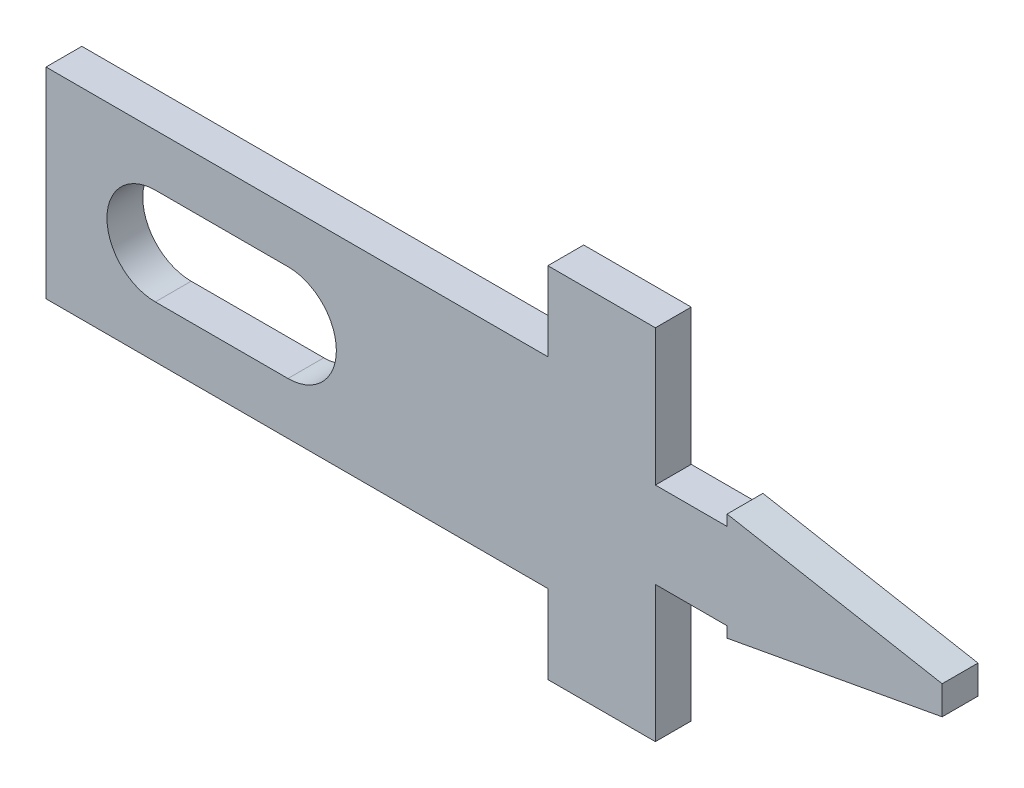
ISO-10303-21;
HEADER;
FILE_DESCRIPTION(('STEP AP214'),'2;1');
FILE_NAME('part.step','',(''),(''),'','','');
FILE_SCHEMA(('AUTOMOTIVE_DESIGN { 1 0 10303 214 1 1 1 1 }'));
ENDSEC;
DATA;
#1=APPLICATION_CONTEXT('core data for automotive mechanical design processes');
#2=APPLICATION_PROTOCOL_DEFINITION('international standard','automotive_design',2000,#1);
#3=PRODUCT_CONTEXT('',#1,'mechanical');
#4=PRODUCT('Part','Part','',(#3));
#5=PRODUCT_RELATED_PRODUCT_CATEGORY('part','',(#4));
#6=PRODUCT_DEFINITION_FORMATION('','',#4);
#7=PRODUCT_DEFINITION_CONTEXT('part definition',#1,'design');
#8=PRODUCT_DEFINITION('design','',#6,#7);
#9=PRODUCT_DEFINITION_SHAPE('','',#8);
#10=(LENGTH_UNIT() NAMED_UNIT(*) SI_UNIT(.MILLI.,.METRE.));
#11=(NAMED_UNIT(*) PLANE_ANGLE_UNIT() SI_UNIT($,.RADIAN.));
#12=(NAMED_UNIT(*) SI_UNIT($,.STERADIAN.) SOLID_ANGLE_UNIT());
#13=UNCERTAINTY_MEASURE_WITH_UNIT(LENGTH_MEASURE(1.E-05),#10,'distance_accuracy_value','');
#14=(GEOMETRIC_REPRESENTATION_CONTEXT(3) GLOBAL_UNCERTAINTY_ASSIGNED_CONTEXT((#13)) GLOBAL_UNIT_ASSIGNED_CONTEXT((#10,
#11,#12)) REPRESENTATION_CONTEXT('',''));
#15=CARTESIAN_POINT('',(0.,0.,0.));
#16=DIRECTION('',(0.,0.,1.));
#17=DIRECTION('',(1.,0.,0.));
#18=AXIS2_PLACEMENT_3D('',#15,#16,#17);
#19=CARTESIAN_POINT('',(0.,0.,0.5));
#20=DIRECTION('',(0.,0.,1.));
#21=DIRECTION('',(1.,0.,0.));
#22=AXIS2_PLACEMENT_3D('',#19,#20,#21);
#23=PLANE('',#22);
#24=DIRECTION('',(0.,1.,0.));
#25=VECTOR('',#24,1.);
#26=CARTESIAN_POINT('',(6.25,0.200000000000002,0.5));
#27=LINE('',#26,#25);
#28=CARTESIAN_POINT('',(6.25,-0.200000000000003,0.5));
#29=VERTEX_POINT('',#28);
#30=CARTESIAN_POINT('',(6.25,0.200000000000002,0.5));
#31=VERTEX_POINT('',#30);
#32=EDGE_CURVE('E225',#29,#31,#27,.T.);
#33=ORIENTED_EDGE('',*,*,#32,.T.);
#34=DIRECTION('',(-0.983606557377049,0.180327868852458,0.));
#35=VECTOR('',#34,1.);
#36=CARTESIAN_POINT('',(3.25,0.75,0.5));
#37=LINE('',#36,#35);
#38=CARTESIAN_POINT('',(3.25,0.75,0.5));
#39=VERTEX_POINT('',#38);
#40=EDGE_CURVE('E229',#31,#39,#37,.T.);
#41=ORIENTED_EDGE('',*,*,#40,.T.);
#42=DIRECTION('',(0.,-1.,0.));
#43=VECTOR('',#42,1.);
#44=CARTESIAN_POINT('',(3.25,0.6,0.5));
#45=LINE('',#44,#43);
#46=CARTESIAN_POINT('',(3.25,0.6,0.5));
#47=VERTEX_POINT('',#46);
#48=EDGE_CURVE('E233',#39,#47,#45,.T.);
#49=ORIENTED_EDGE('',*,*,#48,.T.);
#50=DIRECTION('',(-1.,0.,0.));
#51=VECTOR('',#50,1.);
#52=CARTESIAN_POINT('',(2.25,0.6,0.5));
#53=LINE('',#52,#51);
#54=CARTESIAN_POINT('',(2.25,0.6,0.5));
#55=VERTEX_POINT('',#54);
#56=EDGE_CURVE('E236',#47,#55,#53,.T.);
#57=ORIENTED_EDGE('',*,*,#56,.T.);
#58=DIRECTION('',(0.,1.,0.));
#59=VECTOR('',#58,1.);
#60=CARTESIAN_POINT('',(2.25,2.5,0.5));
#61=LINE('',#60,#59);
#62=CARTESIAN_POINT('',(2.25,2.5,0.5));
#63=VERTEX_POINT('',#62);
#64=EDGE_CURVE('E239',#55,#63,#61,.T.);
#65=ORIENTED_EDGE('',*,*,#64,.T.);
#66=DIRECTION('',(-1.,0.,0.));
#67=VECTOR('',#66,1.);
#68=CARTESIAN_POINT('',(0.749999999999999,2.5,0.5));
#69=LINE('',#68,#67);
#70=CARTESIAN_POINT('',(0.749999999999999,2.5,0.5));
#71=VERTEX_POINT('',#70);
#72=EDGE_CURVE('E242',#63,#71,#69,.T.);
#73=ORIENTED_EDGE('',*,*,#72,.T.);
#74=DIRECTION('',(0.,-1.,0.));
#75=VECTOR('',#74,1.);
#76=CARTESIAN_POINT('',(0.749999999999999,1.4,0.5));
#77=LINE('',#76,#75);
#78=CARTESIAN_POINT('',(0.749999999999999,1.4,0.5));
#79=VERTEX_POINT('',#78);
#80=EDGE_CURVE('E245',#71,#79,#77,.T.);
#81=ORIENTED_EDGE('',*,*,#80,.T.);
#82=DIRECTION('',(-1.,0.,0.));
#83=VECTOR('',#82,1.);
#84=CARTESIAN_POINT('',(-6.25,1.4,0.5));
#85=LINE('',#84,#83);
#86=CARTESIAN_POINT('',(-6.25,1.4,0.5));
#87=VERTEX_POINT('',#86);
#88=EDGE_CURVE('E248',#79,#87,#85,.T.);
#89=ORIENTED_EDGE('',*,*,#88,.T.);
#90=DIRECTION('',(0.,-1.,0.));
#91=VECTOR('',#90,1.);
#92=CARTESIAN_POINT('',(-6.25,-1.4,0.5));
#93=LINE('',#92,#91);
#94=CARTESIAN_POINT('',(-6.25,-1.4,0.5));
#95=VERTEX_POINT('',#94);
#96=EDGE_CURVE('E251',#87,#95,#93,.T.);
#97=ORIENTED_EDGE('',*,*,#96,.T.);
#98=DIRECTION('',(1.,0.,0.));
#99=VECTOR('',#98,1.);
#100=CARTESIAN_POINT('',(-6.25,-1.4,0.5));
#101=LINE('',#100,#99);
#102=CARTESIAN_POINT('',(0.749999999999999,-1.4,0.5));
#103=VERTEX_POINT('',#102);
#104=EDGE_CURVE('E254',#95,#103,#101,.T.);
#105=ORIENTED_EDGE('',*,*,#104,.T.);
#106=DIRECTION('',(0.,-1.,0.));
#107=VECTOR('',#106,1.);
#108=CARTESIAN_POINT('',(0.749999999999999,-1.4,0.5));
#109=LINE('',#108,#107);
#110=CARTESIAN_POINT('',(0.749999999999999,-2.5,0.5));
#111=VERTEX_POINT('',#110);
#112=EDGE_CURVE('E257',#103,#111,#109,.T.);
#113=ORIENTED_EDGE('',*,*,#112,.T.);
#114=DIRECTION('',(1.,0.,0.));
#115=VECTOR('',#114,1.);
#116=CARTESIAN_POINT('',(0.749999999999999,-2.5,0.5));
#117=LINE('',#116,#115);
#118=CARTESIAN_POINT('',(2.25,-2.5,0.5));
#119=VERTEX_POINT('',#118);
#120=EDGE_CURVE('E260',#111,#119,#117,.T.);
#121=ORIENTED_EDGE('',*,*,#120,.T.);
#122=DIRECTION('',(0.,1.,0.));
#123=VECTOR('',#122,1.);
#124=CARTESIAN_POINT('',(2.25,-2.5,0.5));
#125=LINE('',#124,#123);
#126=CARTESIAN_POINT('',(2.25,-0.600000000000001,0.5));
#127=VERTEX_POINT('',#126);
#128=EDGE_CURVE('E263',#119,#127,#125,.T.);
#129=ORIENTED_EDGE('',*,*,#128,.T.);
#130=DIRECTION('',(1.,0.,0.));
#131=VECTOR('',#130,1.);
#132=CARTESIAN_POINT('',(2.25,-0.600000000000001,0.5));
#133=LINE('',#132,#131);
#134=CARTESIAN_POINT('',(3.25,-0.600000000000001,0.5));
#135=VERTEX_POINT('',#134);
#136=EDGE_CURVE('E266',#127,#135,#133,.T.);
#137=ORIENTED_EDGE('',*,*,#136,.T.);
#138=DIRECTION('',(0.,-1.,0.));
#139=VECTOR('',#138,1.);
#140=CARTESIAN_POINT('',(3.25,-0.600000000000001,0.5));
#141=LINE('',#140,#139);
#142=CARTESIAN_POINT('',(3.25,-0.750000000000001,0.5));
#143=VERTEX_POINT('',#142);
#144=EDGE_CURVE('E269',#135,#143,#141,.T.);
#145=ORIENTED_EDGE('',*,*,#144,.T.);
#146=DIRECTION('',(0.983606557377049,0.180327868852458,0.));
#147=VECTOR('',#146,1.);
#148=CARTESIAN_POINT('',(3.25,-0.750000000000001,0.5));
#149=LINE('',#148,#147);
#150=EDGE_CURVE('E272',#143,#29,#149,.T.);
#151=ORIENTED_EDGE('',*,*,#150,.T.);
#152=EDGE_LOOP('',(#33,#41,#49,#57,#65,#73,#81,#89,#97,#105,#113,#121,#129,#137,#145,#151));
#153=FACE_BOUND('',#152,.T.);
#154=DIRECTION('',(1.,0.,0.));
#155=VECTOR('',#154,1.);
#156=CARTESIAN_POINT('',(-2.875,-0.675,0.5));
#157=LINE('',#156,#155);
#158=CARTESIAN_POINT('',(-4.725,-0.675,0.5));
#159=VERTEX_POINT('',#158);
#160=CARTESIAN_POINT('',(-2.875,-0.675,0.5));
#161=VERTEX_POINT('',#160);
#162=EDGE_CURVE('E186',#159,#161,#157,.T.);
#163=ORIENTED_EDGE('',*,*,#162,.F.);
#164=CARTESIAN_POINT('',(-4.725,0.,0.5));
#165=DIRECTION('',(0.,0.,1.));
#166=DIRECTION('',(1.,0.,0.));
#167=AXIS2_PLACEMENT_3D('',#164,#165,#166);
#168=CIRCLE('',#167,0.675);
#169=CARTESIAN_POINT('',(-4.725,0.675,0.5));
#170=VERTEX_POINT('',#169);
#171=EDGE_CURVE('E177',#170,#159,#168,.T.);
#172=ORIENTED_EDGE('',*,*,#171,.F.);
#173=DIRECTION('',(-1.,0.,0.));
#174=VECTOR('',#173,1.);
#175=CARTESIAN_POINT('',(-2.875,0.675,0.5));
#176=LINE('',#175,#174);
#177=CARTESIAN_POINT('',(-2.875,0.675,0.5));
#178=VERTEX_POINT('',#177);
#179=EDGE_CURVE('E203',#178,#170,#176,.T.);
#180=ORIENTED_EDGE('',*,*,#179,.F.);
#181=CARTESIAN_POINT('',(-2.875,0.,0.5));
#182=DIRECTION('',(0.,0.,1.));
#183=DIRECTION('',(1.,0.,0.));
#184=AXIS2_PLACEMENT_3D('',#181,#182,#183);
#185=CIRCLE('',#184,0.675);
#186=EDGE_CURVE('E199',#161,#178,#185,.T.);
#187=ORIENTED_EDGE('',*,*,#186,.F.);
#188=EDGE_LOOP('',(#163,#172,#180,#187));
#189=FACE_BOUND('',#188,.T.);
#190=ADVANCED_FACE('F39',(#153,#189),#23,.T.);
#191=CARTESIAN_POINT('',(0.,0.,0.));
#192=DIRECTION('',(0.,0.,1.));
#193=DIRECTION('',(1.,0.,0.));
#194=AXIS2_PLACEMENT_3D('',#191,#192,#193);
#195=PLANE('',#194);
#196=DIRECTION('',(0.,1.,0.));
#197=VECTOR('',#196,1.);
#198=CARTESIAN_POINT('',(6.25,0.200000000000002,0.));
#199=LINE('',#198,#197);
#200=CARTESIAN_POINT('',(6.25,-0.200000000000003,0.));
#201=VERTEX_POINT('',#200);
#202=CARTESIAN_POINT('',(6.25,0.200000000000002,0.));
#203=VERTEX_POINT('',#202);
#204=EDGE_CURVE('E195',#201,#203,#199,.T.);
#205=ORIENTED_EDGE('',*,*,#204,.F.);
#206=DIRECTION('',(0.983606557377049,0.180327868852458,0.));
#207=VECTOR('',#206,1.);
#208=CARTESIAN_POINT('',(3.25,-0.750000000000001,0.));
#209=LINE('',#208,#207);
#210=CARTESIAN_POINT('',(3.25,-0.750000000000001,0.));
#211=VERTEX_POINT('',#210);
#212=EDGE_CURVE('E230',#211,#201,#209,.T.);
#213=ORIENTED_EDGE('',*,*,#212,.F.);
#214=DIRECTION('',(0.,-1.,0.));
#215=VECTOR('',#214,1.);
#216=CARTESIAN_POINT('',(3.25,-0.600000000000001,0.));
#217=LINE('',#216,#215);
#218=CARTESIAN_POINT('',(3.25,-0.600000000000001,0.));
#219=VERTEX_POINT('',#218);
#220=EDGE_CURVE('E318',#219,#211,#217,.T.);
#221=ORIENTED_EDGE('',*,*,#220,.F.);
#222=DIRECTION('',(1.,0.,0.));
#223=VECTOR('',#222,1.);
#224=CARTESIAN_POINT('',(2.25,-0.600000000000001,0.));
#225=LINE('',#224,#223);
#226=CARTESIAN_POINT('',(2.25,-0.600000000000001,0.));
#227=VERTEX_POINT('',#226);
#228=EDGE_CURVE('E315',#227,#219,#225,.T.);
#229=ORIENTED_EDGE('',*,*,#228,.F.);
#230=DIRECTION('',(0.,1.,0.));
#231=VECTOR('',#230,1.);
#232=CARTESIAN_POINT('',(2.25,-2.5,0.));
#233=LINE('',#232,#231);
#234=CARTESIAN_POINT('',(2.25,-2.5,0.));
#235=VERTEX_POINT('',#234);
#236=EDGE_CURVE('E312',#235,#227,#233,.T.);
#237=ORIENTED_EDGE('',*,*,#236,.F.);
#238=DIRECTION('',(1.,0.,0.));
#239=VECTOR('',#238,1.);
#240=CARTESIAN_POINT('',(0.749999999999999,-2.5,0.));
#241=LINE('',#240,#239);
#242=CARTESIAN_POINT('',(0.749999999999999,-2.5,0.));
#243=VERTEX_POINT('',#242);
#244=EDGE_CURVE('E309',#243,#235,#241,.T.);
#245=ORIENTED_EDGE('',*,*,#244,.F.);
#246=DIRECTION('',(0.,-1.,0.));
#247=VECTOR('',#246,1.);
#248=CARTESIAN_POINT('',(0.749999999999999,-1.4,0.));
#249=LINE('',#248,#247);
#250=CARTESIAN_POINT('',(0.749999999999999,-1.4,0.));
#251=VERTEX_POINT('',#250);
#252=EDGE_CURVE('E306',#251,#243,#249,.T.);
#253=ORIENTED_EDGE('',*,*,#252,.F.);
#254=DIRECTION('',(1.,0.,0.));
#255=VECTOR('',#254,1.);
#256=CARTESIAN_POINT('',(-6.25,-1.4,0.));
#257=LINE('',#256,#255);
#258=CARTESIAN_POINT('',(-6.25,-1.4,0.));
#259=VERTEX_POINT('',#258);
#260=EDGE_CURVE('E303',#259,#251,#257,.T.);
#261=ORIENTED_EDGE('',*,*,#260,.F.);
#262=DIRECTION('',(0.,-1.,0.));
#263=VECTOR('',#262,1.);
#264=CARTESIAN_POINT('',(-6.25,-1.4,0.));
#265=LINE('',#264,#263);
#266=CARTESIAN_POINT('',(-6.25,1.4,0.));
#267=VERTEX_POINT('',#266);
#268=EDGE_CURVE('E300',#267,#259,#265,.T.);
#269=ORIENTED_EDGE('',*,*,#268,.F.);
#270=DIRECTION('',(-1.,0.,0.));
#271=VECTOR('',#270,1.);
#272=CARTESIAN_POINT('',(-6.25,1.4,0.));
#273=LINE('',#272,#271);
#274=CARTESIAN_POINT('',(0.749999999999999,1.4,0.));
#275=VERTEX_POINT('',#274);
#276=EDGE_CURVE('E297',#275,#267,#273,.T.);
#277=ORIENTED_EDGE('',*,*,#276,.F.);
#278=DIRECTION('',(0.,-1.,0.));
#279=VECTOR('',#278,1.);
#280=CARTESIAN_POINT('',(0.749999999999999,1.4,0.));
#281=LINE('',#280,#279);
#282=CARTESIAN_POINT('',(0.749999999999999,2.5,0.));
#283=VERTEX_POINT('',#282);
#284=EDGE_CURVE('E294',#283,#275,#281,.T.);
#285=ORIENTED_EDGE('',*,*,#284,.F.);
#286=DIRECTION('',(-1.,0.,0.));
#287=VECTOR('',#286,1.);
#288=CARTESIAN_POINT('',(0.749999999999999,2.5,0.));
#289=LINE('',#288,#287);
#290=CARTESIAN_POINT('',(2.25,2.5,0.));
#291=VERTEX_POINT('',#290);
#292=EDGE_CURVE('E291',#291,#283,#289,.T.);
#293=ORIENTED_EDGE('',*,*,#292,.F.);
#294=DIRECTION('',(0.,1.,0.));
#295=VECTOR('',#294,1.);
#296=CARTESIAN_POINT('',(2.25,2.5,0.));
#297=LINE('',#296,#295);
#298=CARTESIAN_POINT('',(2.25,0.6,0.));
#299=VERTEX_POINT('',#298);
#300=EDGE_CURVE('E288',#299,#291,#297,.T.);
#301=ORIENTED_EDGE('',*,*,#300,.F.);
#302=DIRECTION('',(-1.,0.,0.));
#303=VECTOR('',#302,1.);
#304=CARTESIAN_POINT('',(2.25,0.6,0.));
#305=LINE('',#304,#303);
#306=CARTESIAN_POINT('',(3.25,0.6,0.));
#307=VERTEX_POINT('',#306);
#308=EDGE_CURVE('E285',#307,#299,#305,.T.);
#309=ORIENTED_EDGE('',*,*,#308,.F.);
#310=DIRECTION('',(0.,-1.,0.));
#311=VECTOR('',#310,1.);
#312=CARTESIAN_POINT('',(3.25,0.6,0.));
#313=LINE('',#312,#311);
#314=CARTESIAN_POINT('',(3.25,0.75,0.));
#315=VERTEX_POINT('',#314);
#316=EDGE_CURVE('E282',#315,#307,#313,.T.);
#317=ORIENTED_EDGE('',*,*,#316,.F.);
#318=DIRECTION('',(-0.983606557377049,0.180327868852458,0.));
#319=VECTOR('',#318,1.);
#320=CARTESIAN_POINT('',(3.25,0.75,0.));
#321=LINE('',#320,#319);
#322=EDGE_CURVE('E279',#203,#315,#321,.T.);
#323=ORIENTED_EDGE('',*,*,#322,.F.);
#324=EDGE_LOOP('',(#205,#213,#221,#229,#237,#245,#253,#261,#269,#277,#285,#293,#301,#309,#317,#323));
#325=FACE_BOUND('',#324,.T.);
#326=CARTESIAN_POINT('',(-4.725,0.,0.));
#327=DIRECTION('',(0.,0.,1.));
#328=DIRECTION('',(1.,0.,0.));
#329=AXIS2_PLACEMENT_3D('',#326,#327,#328);
#330=CIRCLE('',#329,0.675);
#331=CARTESIAN_POINT('',(-4.725,0.675,0.));
#332=VERTEX_POINT('',#331);
#333=CARTESIAN_POINT('',(-4.725,-0.675,0.));
#334=VERTEX_POINT('',#333);
#335=EDGE_CURVE('E63',#332,#334,#330,.T.);
#336=ORIENTED_EDGE('',*,*,#335,.T.);
#337=DIRECTION('',(1.,0.,0.));
#338=VECTOR('',#337,1.);
#339=CARTESIAN_POINT('',(-2.875,-0.675,0.));
#340=LINE('',#339,#338);
#341=CARTESIAN_POINT('',(-2.875,-0.675,0.));
#342=VERTEX_POINT('',#341);
#343=EDGE_CURVE('E193',#334,#342,#340,.T.);
#344=ORIENTED_EDGE('',*,*,#343,.T.);
#345=CARTESIAN_POINT('',(-2.875,0.,0.));
#346=DIRECTION('',(0.,0.,1.));
#347=DIRECTION('',(1.,0.,0.));
#348=AXIS2_PLACEMENT_3D('',#345,#346,#347);
#349=CIRCLE('',#348,0.675);
#350=CARTESIAN_POINT('',(-2.875,0.675,0.));
#351=VERTEX_POINT('',#350);
#352=EDGE_CURVE('E212',#342,#351,#349,.T.);
#353=ORIENTED_EDGE('',*,*,#352,.T.);
#354=DIRECTION('',(-1.,0.,0.));
#355=VECTOR('',#354,1.);
#356=CARTESIAN_POINT('',(-2.875,0.675,0.));
#357=LINE('',#356,#355);
#358=EDGE_CURVE('E187',#351,#332,#357,.T.);
#359=ORIENTED_EDGE('',*,*,#358,.T.);
#360=EDGE_LOOP('',(#336,#344,#353,#359));
#361=FACE_BOUND('',#360,.T.);
#362=ADVANCED_FACE('F389',(#325,#361),#195,.F.);
#363=CARTESIAN_POINT('',(6.25,0.200000000000002,0.5));
#364=DIRECTION('',(-1.,0.,0.));
#365=DIRECTION('',(0.,0.,1.));
#366=AXIS2_PLACEMENT_3D('',#363,#364,#365);
#367=PLANE('',#366);
#368=ORIENTED_EDGE('',*,*,#204,.T.);
#369=DIRECTION('',(0.,0.,-1.));
#370=VECTOR('',#369,1.);
#371=CARTESIAN_POINT('',(6.25,0.200000000000002,0.5));
#372=LINE('',#371,#370);
#373=EDGE_CURVE('E11',#31,#203,#372,.T.);
#374=ORIENTED_EDGE('',*,*,#373,.F.);
#375=ORIENTED_EDGE('',*,*,#32,.F.);
#376=DIRECTION('',(0.,0.,-1.));
#377=VECTOR('',#376,1.);
#378=CARTESIAN_POINT('',(6.25,-0.200000000000003,0.5));
#379=LINE('',#378,#377);
#380=EDGE_CURVE('E275',#29,#201,#379,.T.);
#381=ORIENTED_EDGE('',*,*,#380,.T.);
#382=EDGE_LOOP('',(#368,#374,#375,#381));
#383=FACE_BOUND('',#382,.T.);
#384=ADVANCED_FACE('F41',(#383),#367,.F.);
#385=CARTESIAN_POINT('',(3.25,0.75,0.5));
#386=DIRECTION('',(-0.180327868852458,-0.983606557377049,0.));
#387=DIRECTION('',(0.983606557377049,-0.180327868852458,0.));
#388=AXIS2_PLACEMENT_3D('',#385,#386,#387);
#389=PLANE('',#388);
#390=ORIENTED_EDGE('',*,*,#322,.T.);
#391=DIRECTION('',(0.,0.,-1.));
#392=VECTOR('',#391,1.);
#393=CARTESIAN_POINT('',(3.25,0.75,0.5));
#394=LINE('',#393,#392);
#395=EDGE_CURVE('E48',#39,#315,#394,.T.);
#396=ORIENTED_EDGE('',*,*,#395,.F.);
#397=ORIENTED_EDGE('',*,*,#40,.F.);
#398=ORIENTED_EDGE('',*,*,#373,.T.);
#399=EDGE_LOOP('',(#390,#396,#397,#398));
#400=FACE_BOUND('',#399,.T.);
#401=ADVANCED_FACE('F406',(#400),#389,.F.);
#402=CARTESIAN_POINT('',(3.25,0.6,0.5));
#403=DIRECTION('',(1.,0.,0.));
#404=DIRECTION('',(0.,0.,-1.));
#405=AXIS2_PLACEMENT_3D('',#402,#403,#404);
#406=PLANE('',#405);
#407=ORIENTED_EDGE('',*,*,#316,.T.);
#408=DIRECTION('',(0.,0.,-1.));
#409=VECTOR('',#408,1.);
#410=CARTESIAN_POINT('',(3.25,0.6,0.5));
#411=LINE('',#410,#409);
#412=EDGE_CURVE('E374',#47,#307,#411,.T.);
#413=ORIENTED_EDGE('',*,*,#412,.F.);
#414=ORIENTED_EDGE('',*,*,#48,.F.);
#415=ORIENTED_EDGE('',*,*,#395,.T.);
#416=EDGE_LOOP('',(#407,#413,#414,#415));
#417=FACE_BOUND('',#416,.T.);
#418=ADVANCED_FACE('F383',(#417),#406,.F.);
#419=CARTESIAN_POINT('',(2.25,0.6,0.5));
#420=DIRECTION('',(0.,-1.,0.));
#421=DIRECTION('',(0.,0.,-1.));
#422=AXIS2_PLACEMENT_3D('',#419,#420,#421);
#423=PLANE('',#422);
#424=ORIENTED_EDGE('',*,*,#308,.T.);
#425=DIRECTION('',(0.,0.,-1.));
#426=VECTOR('',#425,1.);
#427=CARTESIAN_POINT('',(2.25,0.6,0.5));
#428=LINE('',#427,#426);
#429=EDGE_CURVE('E370',#55,#299,#428,.T.);
#430=ORIENTED_EDGE('',*,*,#429,.F.);
#431=ORIENTED_EDGE('',*,*,#56,.F.);
#432=ORIENTED_EDGE('',*,*,#412,.T.);
#433=EDGE_LOOP('',(#424,#430,#431,#432));
#434=FACE_BOUND('',#433,.T.);
#435=ADVANCED_FACE('F395',(#434),#423,.F.);
#436=CARTESIAN_POINT('',(2.25,2.5,0.5));
#437=DIRECTION('',(-1.,0.,0.));
#438=DIRECTION('',(0.,0.,1.));
#439=AXIS2_PLACEMENT_3D('',#436,#437,#438);
#440=PLANE('',#439);
#441=ORIENTED_EDGE('',*,*,#300,.T.);
#442=DIRECTION('',(0.,0.,-1.));
#443=VECTOR('',#442,1.);
#444=CARTESIAN_POINT('',(2.25,2.5,0.5));
#445=LINE('',#444,#443);
#446=EDGE_CURVE('E366',#63,#291,#445,.T.);
#447=ORIENTED_EDGE('',*,*,#446,.F.);
#448=ORIENTED_EDGE('',*,*,#64,.F.);
#449=ORIENTED_EDGE('',*,*,#429,.T.);
#450=EDGE_LOOP('',(#441,#447,#448,#449));
#451=FACE_BOUND('',#450,.T.);
#452=ADVANCED_FACE('F399',(#451),#440,.F.);
#453=CARTESIAN_POINT('',(0.749999999999999,2.5,0.5));
#454=DIRECTION('',(0.,-1.,0.));
#455=DIRECTION('',(1.,0.,0.));
#456=AXIS2_PLACEMENT_3D('',#453,#454,#455);
#457=PLANE('',#456);
#458=ORIENTED_EDGE('',*,*,#292,.T.);
#459=DIRECTION('',(0.,0.,-1.));
#460=VECTOR('',#459,1.);
#461=CARTESIAN_POINT('',(0.749999999999999,2.5,0.5));
#462=LINE('',#461,#460);
#463=EDGE_CURVE('E362',#71,#283,#462,.T.);
#464=ORIENTED_EDGE('',*,*,#463,.F.);
#465=ORIENTED_EDGE('',*,*,#72,.F.);
#466=ORIENTED_EDGE('',*,*,#446,.T.);
#467=EDGE_LOOP('',(#458,#464,#465,#466));
#468=FACE_BOUND('',#467,.T.);
#469=ADVANCED_FACE('F459',(#468),#457,.F.);
#470=CARTESIAN_POINT('',(0.749999999999999,1.4,0.5));
#471=DIRECTION('',(1.,0.,0.));
#472=DIRECTION('',(0.,1.,0.));
#473=AXIS2_PLACEMENT_3D('',#470,#471,#472);
#474=PLANE('',#473);
#475=ORIENTED_EDGE('',*,*,#284,.T.);
#476=DIRECTION('',(0.,0.,-1.));
#477=VECTOR('',#476,1.);
#478=CARTESIAN_POINT('',(0.749999999999999,1.4,0.5));
#479=LINE('',#478,#477);
#480=EDGE_CURVE('E358',#79,#275,#479,.T.);
#481=ORIENTED_EDGE('',*,*,#480,.F.);
#482=ORIENTED_EDGE('',*,*,#80,.F.);
#483=ORIENTED_EDGE('',*,*,#463,.T.);
#484=EDGE_LOOP('',(#475,#481,#482,#483));
#485=FACE_BOUND('',#484,.T.);
#486=ADVANCED_FACE('F456',(#485),#474,.F.);
#487=CARTESIAN_POINT('',(-6.25,1.4,0.5));
#488=DIRECTION('',(0.,-1.,0.));
#489=DIRECTION('',(0.,0.,-1.));
#490=AXIS2_PLACEMENT_3D('',#487,#488,#489);
#491=PLANE('',#490);
#492=ORIENTED_EDGE('',*,*,#276,.T.);
#493=DIRECTION('',(0.,0.,-1.));
#494=VECTOR('',#493,1.);
#495=CARTESIAN_POINT('',(-6.25,1.4,0.5));
#496=LINE('',#495,#494);
#497=EDGE_CURVE('E354',#87,#267,#496,.T.);
#498=ORIENTED_EDGE('',*,*,#497,.F.);
#499=ORIENTED_EDGE('',*,*,#88,.F.);
#500=ORIENTED_EDGE('',*,*,#480,.T.);
#501=EDGE_LOOP('',(#492,#498,#499,#500));
#502=FACE_BOUND('',#501,.T.);
#503=ADVANCED_FACE('F452',(#502),#491,.F.);
#504=CARTESIAN_POINT('',(-6.25,-1.4,0.5));
#505=DIRECTION('',(1.,0.,0.));
#506=DIRECTION('',(0.,0.,-1.));
#507=AXIS2_PLACEMENT_3D('',#504,#505,#506);
#508=PLANE('',#507);
#509=ORIENTED_EDGE('',*,*,#268,.T.);
#510=DIRECTION('',(0.,0.,-1.));
#511=VECTOR('',#510,1.);
#512=CARTESIAN_POINT('',(-6.25,-1.4,0.5));
#513=LINE('',#512,#511);
#514=EDGE_CURVE('E350',#95,#259,#513,.T.);
#515=ORIENTED_EDGE('',*,*,#514,.F.);
#516=ORIENTED_EDGE('',*,*,#96,.F.);
#517=ORIENTED_EDGE('',*,*,#497,.T.);
#518=EDGE_LOOP('',(#509,#515,#516,#517));
#519=FACE_BOUND('',#518,.T.);
#520=ADVANCED_FACE('F448',(#519),#508,.F.);
#521=CARTESIAN_POINT('',(-6.25,-1.4,0.5));
#522=DIRECTION('',(0.,1.,0.));
#523=DIRECTION('',(0.,0.,1.));
#524=AXIS2_PLACEMENT_3D('',#521,#522,#523);
#525=PLANE('',#524);
#526=ORIENTED_EDGE('',*,*,#260,.T.);
#527=DIRECTION('',(0.,0.,-1.));
#528=VECTOR('',#527,1.);
#529=CARTESIAN_POINT('',(0.749999999999999,-1.4,0.5));
#530=LINE('',#529,#528);
#531=EDGE_CURVE('E346',#103,#251,#530,.T.);
#532=ORIENTED_EDGE('',*,*,#531,.F.);
#533=ORIENTED_EDGE('',*,*,#104,.F.);
#534=ORIENTED_EDGE('',*,*,#514,.T.);
#535=EDGE_LOOP('',(#526,#532,#533,#534));
#536=FACE_BOUND('',#535,.T.);
#537=ADVANCED_FACE('F443',(#536),#525,.F.);
#538=CARTESIAN_POINT('',(0.749999999999999,-1.4,0.5));
#539=DIRECTION('',(1.,0.,0.));
#540=DIRECTION('',(0.,1.,0.));
#541=AXIS2_PLACEMENT_3D('',#538,#539,#540);
#542=PLANE('',#541);
#543=ORIENTED_EDGE('',*,*,#252,.T.);
#544=DIRECTION('',(0.,0.,-1.));
#545=VECTOR('',#544,1.);
#546=CARTESIAN_POINT('',(0.749999999999999,-2.5,0.5));
#547=LINE('',#546,#545);
#548=EDGE_CURVE('E342',#111,#243,#547,.T.);
#549=ORIENTED_EDGE('',*,*,#548,.F.);
#550=ORIENTED_EDGE('',*,*,#112,.F.);
#551=ORIENTED_EDGE('',*,*,#531,.T.);
#552=EDGE_LOOP('',(#543,#549,#550,#551));
#553=FACE_BOUND('',#552,.T.);
#554=ADVANCED_FACE('F437',(#553),#542,.F.);
#555=CARTESIAN_POINT('',(0.749999999999999,-2.5,0.5));
#556=DIRECTION('',(0.,1.,0.));
#557=DIRECTION('',(-1.,0.,0.));
#558=AXIS2_PLACEMENT_3D('',#555,#556,#557);
#559=PLANE('',#558);
#560=ORIENTED_EDGE('',*,*,#244,.T.);
#561=DIRECTION('',(0.,0.,-1.));
#562=VECTOR('',#561,1.);
#563=CARTESIAN_POINT('',(2.25,-2.5,0.5));
#564=LINE('',#563,#562);
#565=EDGE_CURVE('E338',#119,#235,#564,.T.);
#566=ORIENTED_EDGE('',*,*,#565,.F.);
#567=ORIENTED_EDGE('',*,*,#120,.F.);
#568=ORIENTED_EDGE('',*,*,#548,.T.);
#569=EDGE_LOOP('',(#560,#566,#567,#568));
#570=FACE_BOUND('',#569,.T.);
#571=ADVANCED_FACE('F433',(#570),#559,.F.);
#572=CARTESIAN_POINT('',(2.25,-2.5,0.5));
#573=DIRECTION('',(-1.,0.,0.));
#574=DIRECTION('',(0.,0.,1.));
#575=AXIS2_PLACEMENT_3D('',#572,#573,#574);
#576=PLANE('',#575);
#577=ORIENTED_EDGE('',*,*,#236,.T.);
#578=DIRECTION('',(0.,0.,-1.));
#579=VECTOR('',#578,1.);
#580=CARTESIAN_POINT('',(2.25,-0.600000000000001,0.5));
#581=LINE('',#580,#579);
#582=EDGE_CURVE('E334',#127,#227,#581,.T.);
#583=ORIENTED_EDGE('',*,*,#582,.F.);
#584=ORIENTED_EDGE('',*,*,#128,.F.);
#585=ORIENTED_EDGE('',*,*,#565,.T.);
#586=EDGE_LOOP('',(#577,#583,#584,#585));
#587=FACE_BOUND('',#586,.T.);
#588=ADVANCED_FACE('F428',(#587),#576,.F.);
#589=CARTESIAN_POINT('',(2.25,-0.600000000000001,0.5));
#590=DIRECTION('',(0.,1.,0.));
#591=DIRECTION('',(0.,0.,1.));
#592=AXIS2_PLACEMENT_3D('',#589,#590,#591);
#593=PLANE('',#592);
#594=ORIENTED_EDGE('',*,*,#228,.T.);
#595=DIRECTION('',(0.,0.,-1.));
#596=VECTOR('',#595,1.);
#597=CARTESIAN_POINT('',(3.25,-0.600000000000001,0.5));
#598=LINE('',#597,#596);
#599=EDGE_CURVE('E330',#135,#219,#598,.T.);
#600=ORIENTED_EDGE('',*,*,#599,.F.);
#601=ORIENTED_EDGE('',*,*,#136,.F.);
#602=ORIENTED_EDGE('',*,*,#582,.T.);
#603=EDGE_LOOP('',(#594,#600,#601,#602));
#604=FACE_BOUND('',#603,.T.);
#605=ADVANCED_FACE('F422',(#604),#593,.F.);
#606=CARTESIAN_POINT('',(3.25,-0.600000000000001,0.5));
#607=DIRECTION('',(1.,0.,0.));
#608=DIRECTION('',(0.,0.,-1.));
#609=AXIS2_PLACEMENT_3D('',#606,#607,#608);
#610=PLANE('',#609);
#611=ORIENTED_EDGE('',*,*,#220,.T.);
#612=DIRECTION('',(0.,0.,-1.));
#613=VECTOR('',#612,1.);
#614=CARTESIAN_POINT('',(3.25,-0.750000000000001,0.5));
#615=LINE('',#614,#613);
#616=EDGE_CURVE('E326',#143,#211,#615,.T.);
#617=ORIENTED_EDGE('',*,*,#616,.F.);
#618=ORIENTED_EDGE('',*,*,#144,.F.);
#619=ORIENTED_EDGE('',*,*,#599,.T.);
#620=EDGE_LOOP('',(#611,#617,#618,#619));
#621=FACE_BOUND('',#620,.T.);
#622=ADVANCED_FACE('F418',(#621),#610,.F.);
#623=CARTESIAN_POINT('',(3.25,-0.750000000000001,0.5));
#624=DIRECTION('',(-0.180327868852458,0.983606557377049,0.));
#625=DIRECTION('',(-0.983606557377049,-0.180327868852458,0.));
#626=AXIS2_PLACEMENT_3D('',#623,#624,#625);
#627=PLANE('',#626);
#628=ORIENTED_EDGE('',*,*,#212,.T.);
#629=ORIENTED_EDGE('',*,*,#380,.F.);
#630=ORIENTED_EDGE('',*,*,#150,.F.);
#631=ORIENTED_EDGE('',*,*,#616,.T.);
#632=EDGE_LOOP('',(#628,#629,#630,#631));
#633=FACE_BOUND('',#632,.T.);
#634=ADVANCED_FACE('F413',(#633),#627,.F.);
#635=CARTESIAN_POINT('',(-4.725,0.,0.5));
#636=DIRECTION('',(0.,0.,-1.));
#637=DIRECTION('',(-1.,0.,0.));
#638=AXIS2_PLACEMENT_3D('',#635,#636,#637);
#639=CYLINDRICAL_SURFACE('',#638,0.675);
#640=ORIENTED_EDGE('',*,*,#335,.F.);
#641=DIRECTION('',(0.,0.,-1.));
#642=VECTOR('',#641,1.);
#643=CARTESIAN_POINT('',(-4.725,0.675,0.5));
#644=LINE('',#643,#642);
#645=EDGE_CURVE('E181',#170,#332,#644,.T.);
#646=ORIENTED_EDGE('',*,*,#645,.F.);
#647=ORIENTED_EDGE('',*,*,#171,.T.);
#648=DIRECTION('',(0.,0.,-1.));
#649=VECTOR('',#648,1.);
#650=CARTESIAN_POINT('',(-4.725,-0.675,0.5));
#651=LINE('',#650,#649);
#652=EDGE_CURVE('E180',#159,#334,#651,.T.);
#653=ORIENTED_EDGE('',*,*,#652,.T.);
#654=EDGE_LOOP('',(#640,#646,#647,#653));
#655=FACE_BOUND('',#654,.T.);
#656=ADVANCED_FACE('F179',(#655),#639,.F.);
#657=CARTESIAN_POINT('',(-2.875,-0.675,0.5));
#658=DIRECTION('',(0.,1.,0.));
#659=DIRECTION('',(-1.,0.,0.));
#660=AXIS2_PLACEMENT_3D('',#657,#658,#659);
#661=PLANE('',#660);
#662=ORIENTED_EDGE('',*,*,#343,.F.);
#663=ORIENTED_EDGE('',*,*,#652,.F.);
#664=ORIENTED_EDGE('',*,*,#162,.T.);
#665=DIRECTION('',(0.,0.,-1.));
#666=VECTOR('',#665,1.);
#667=CARTESIAN_POINT('',(-2.875,-0.675,0.5));
#668=LINE('',#667,#666);
#669=EDGE_CURVE('E196',#161,#342,#668,.T.);
#670=ORIENTED_EDGE('',*,*,#669,.T.);
#671=EDGE_LOOP('',(#662,#663,#664,#670));
#672=FACE_BOUND('',#671,.T.);
#673=ADVANCED_FACE('F190',(#672),#661,.T.);
#674=CARTESIAN_POINT('',(-2.875,0.,0.5));
#675=DIRECTION('',(0.,0.,-1.));
#676=DIRECTION('',(-1.,0.,0.));
#677=AXIS2_PLACEMENT_3D('',#674,#675,#676);
#678=CYLINDRICAL_SURFACE('',#677,0.675);
#679=ORIENTED_EDGE('',*,*,#352,.F.);
#680=ORIENTED_EDGE('',*,*,#669,.F.);
#681=ORIENTED_EDGE('',*,*,#186,.T.);
#682=DIRECTION('',(0.,0.,-1.));
#683=VECTOR('',#682,1.);
#684=CARTESIAN_POINT('',(-2.875,0.675,0.5));
#685=LINE('',#684,#683);
#686=EDGE_CURVE('E55',#178,#351,#685,.T.);
#687=ORIENTED_EDGE('',*,*,#686,.T.);
#688=EDGE_LOOP('',(#679,#680,#681,#687));
#689=FACE_BOUND('',#688,.T.);
#690=ADVANCED_FACE('F541',(#689),#678,.F.);
#691=CARTESIAN_POINT('',(-2.875,0.675,0.5));
#692=DIRECTION('',(0.,-1.,0.));
#693=DIRECTION('',(1.,0.,0.));
#694=AXIS2_PLACEMENT_3D('',#691,#692,#693);
#695=PLANE('',#694);
#696=ORIENTED_EDGE('',*,*,#358,.F.);
#697=ORIENTED_EDGE('',*,*,#686,.F.);
#698=ORIENTED_EDGE('',*,*,#179,.T.);
#699=ORIENTED_EDGE('',*,*,#645,.T.);
#700=EDGE_LOOP('',(#696,#697,#698,#699));
#701=FACE_BOUND('',#700,.T.);
#702=ADVANCED_FACE('F547',(#701),#695,.T.);
#703=CLOSED_SHELL('',(#190,#362,#384,#401,#418,#435,#452,#469,#486,#503,#520,#537,#554,#571,
#588,#605,#622,#634,#656,#673,#690,#702));
#704=MANIFOLD_SOLID_BREP('B2',#703);
#705=ADVANCED_BREP_SHAPE_REPRESENTATION('',(#18,#704),#14);
#706=SHAPE_DEFINITION_REPRESENTATION(#9,#705);
ENDSEC;
END-ISO-10303-21;
